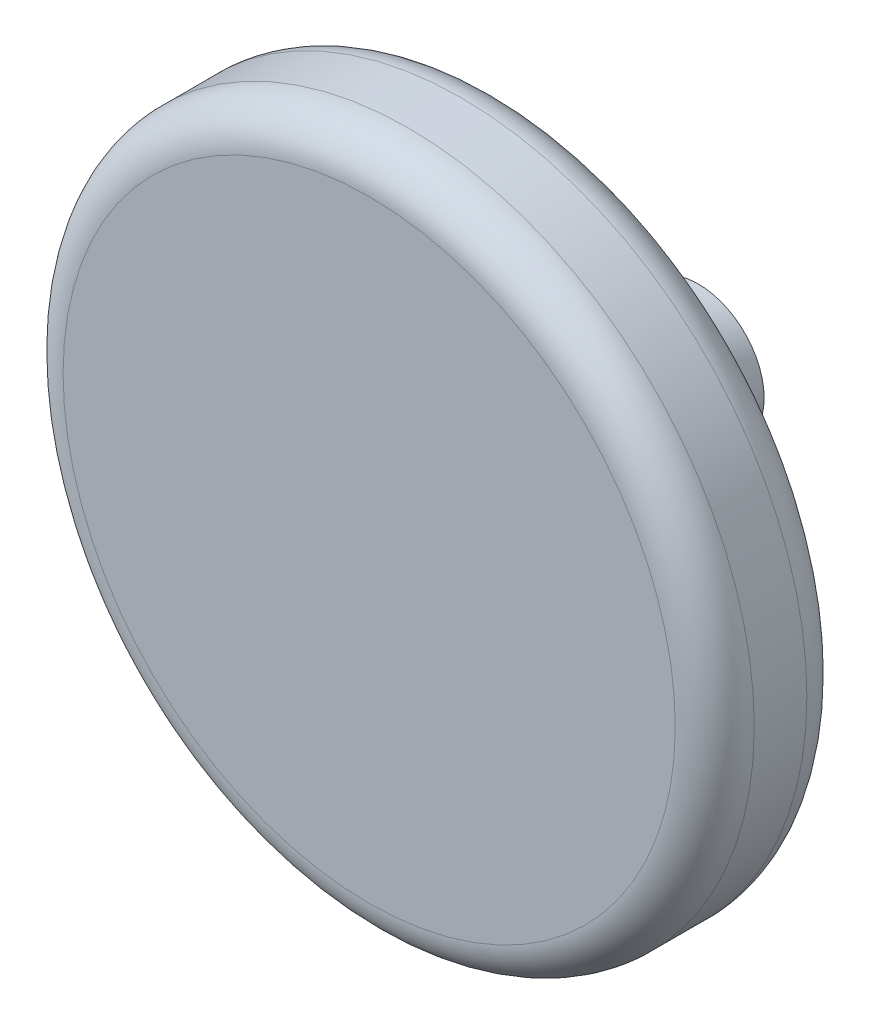
ISO-10303-21;
HEADER;
FILE_DESCRIPTION(('STEP AP214'),'2;1');
FILE_NAME('part.step','',(''),(''),'','','');
FILE_SCHEMA(('AUTOMOTIVE_DESIGN { 1 0 10303 214 1 1 1 1 }'));
ENDSEC;
DATA;
#1=APPLICATION_CONTEXT('core data for automotive mechanical design processes');
#2=APPLICATION_PROTOCOL_DEFINITION('international standard','automotive_design',2000,#1);
#3=PRODUCT_CONTEXT('',#1,'mechanical');
#4=PRODUCT('Part','Part','',(#3));
#5=PRODUCT_RELATED_PRODUCT_CATEGORY('part','',(#4));
#6=PRODUCT_DEFINITION_FORMATION('','',#4);
#7=PRODUCT_DEFINITION_CONTEXT('part definition',#1,'design');
#8=PRODUCT_DEFINITION('design','',#6,#7);
#9=PRODUCT_DEFINITION_SHAPE('','',#8);
#10=(LENGTH_UNIT() NAMED_UNIT(*) SI_UNIT(.MILLI.,.METRE.));
#11=(NAMED_UNIT(*) PLANE_ANGLE_UNIT() SI_UNIT($,.RADIAN.));
#12=(NAMED_UNIT(*) SI_UNIT($,.STERADIAN.) SOLID_ANGLE_UNIT());
#13=UNCERTAINTY_MEASURE_WITH_UNIT(LENGTH_MEASURE(1.E-05),#10,'distance_accuracy_value','');
#14=(GEOMETRIC_REPRESENTATION_CONTEXT(3) GLOBAL_UNCERTAINTY_ASSIGNED_CONTEXT((#13)) GLOBAL_UNIT_ASSIGNED_CONTEXT((#10,
#11,#12)) REPRESENTATION_CONTEXT('',''));
#15=CARTESIAN_POINT('',(0.,0.,0.));
#16=DIRECTION('',(0.,0.,1.));
#17=DIRECTION('',(1.,0.,0.));
#18=AXIS2_PLACEMENT_3D('',#15,#16,#17);
#19=CARTESIAN_POINT('',(0.,0.,0.));
#20=DIRECTION('',(0.,0.,1.));
#21=DIRECTION('',(1.,0.,0.));
#22=AXIS2_PLACEMENT_3D('',#19,#20,#21);
#23=PLANE('',#22);
#24=CARTESIAN_POINT('',(0.,0.,0.));
#25=DIRECTION('',(0.,0.,-1.));
#26=DIRECTION('',(-1.,0.,0.));
#27=AXIS2_PLACEMENT_3D('',#24,#25,#26);
#28=CIRCLE('',#27,1.6256);
#29=CARTESIAN_POINT('',(-1.6256,0.,0.));
#30=VERTEX_POINT('',#29);
#31=EDGE_CURVE('E59',#30,#30,#28,.T.);
#32=ORIENTED_EDGE('',*,*,#31,.F.);
#33=EDGE_LOOP('',(#32));
#34=FACE_BOUND('',#33,.T.);
#35=CARTESIAN_POINT('',(0.,0.,0.));
#36=DIRECTION('',(0.,0.,1.));
#37=DIRECTION('',(1.,0.,0.));
#38=AXIS2_PLACEMENT_3D('',#35,#36,#37);
#39=CIRCLE('',#38,4.23333333333333);
#40=CARTESIAN_POINT('',(4.23333333333333,0.,0.));
#41=VERTEX_POINT('',#40);
#42=EDGE_CURVE('E55',#41,#41,#39,.T.);
#43=ORIENTED_EDGE('',*,*,#42,.F.);
#44=EDGE_LOOP('',(#43));
#45=FACE_BOUND('',#44,.T.);
#46=ADVANCED_FACE('F32',(#34,#45),#23,.F.);
#47=CARTESIAN_POINT('',(0.,0.,21.1666666666667));
#48=DIRECTION('',(0.,0.,-1.));
#49=DIRECTION('',(-1.,0.,0.));
#50=AXIS2_PLACEMENT_3D('',#47,#48,#49);
#51=CYLINDRICAL_SURFACE('',#50,22.225);
#52=CARTESIAN_POINT('',(0.,0.,18.6266666666667));
#53=DIRECTION('',(0.,0.,1.));
#54=DIRECTION('',(1.,0.,0.));
#55=AXIS2_PLACEMENT_3D('',#52,#53,#54);
#56=CIRCLE('',#55,22.225);
#57=CARTESIAN_POINT('',(22.225,0.,18.6266666666667));
#58=VERTEX_POINT('',#57);
#59=EDGE_CURVE('E39',#58,#58,#56,.F.);
#60=ORIENTED_EDGE('',*,*,#59,.T.);
#61=EDGE_LOOP('',(#60));
#62=FACE_BOUND('',#61,.T.);
#63=CARTESIAN_POINT('',(0.,0.,15.24));
#64=DIRECTION('',(0.,0.,1.));
#65=DIRECTION('',(1.,0.,0.));
#66=AXIS2_PLACEMENT_3D('',#63,#64,#65);
#67=CIRCLE('',#66,22.225);
#68=CARTESIAN_POINT('',(22.225,0.,15.24));
#69=VERTEX_POINT('',#68);
#70=EDGE_CURVE('E43',#69,#69,#67,.T.);
#71=ORIENTED_EDGE('',*,*,#70,.T.);
#72=EDGE_LOOP('',(#71));
#73=FACE_BOUND('',#72,.T.);
#74=ADVANCED_FACE('F75',(#62,#73),#51,.T.);
#75=CARTESIAN_POINT('',(0.,0.,21.1666666666667));
#76=DIRECTION('',(0.,0.,1.));
#77=DIRECTION('',(1.,0.,0.));
#78=AXIS2_PLACEMENT_3D('',#75,#76,#77);
#79=PLANE('',#78);
#80=CARTESIAN_POINT('',(0.,0.,21.1666666666667));
#81=DIRECTION('',(0.,0.,1.));
#82=DIRECTION('',(1.,0.,0.));
#83=AXIS2_PLACEMENT_3D('',#80,#81,#82);
#84=CIRCLE('',#83,19.685);
#85=CARTESIAN_POINT('',(19.685,0.,21.1666666666667));
#86=VERTEX_POINT('',#85);
#87=EDGE_CURVE('E47',#86,#86,#84,.T.);
#88=ORIENTED_EDGE('',*,*,#87,.T.);
#89=EDGE_LOOP('',(#88));
#90=FACE_BOUND('',#89,.T.);
#91=ADVANCED_FACE('F88',(#90),#79,.T.);
#92=CARTESIAN_POINT('',(0.,0.,12.7));
#93=DIRECTION('',(0.,0.,1.));
#94=DIRECTION('',(1.,0.,0.));
#95=AXIS2_PLACEMENT_3D('',#92,#93,#94);
#96=PLANE('',#95);
#97=CARTESIAN_POINT('',(0.,0.,12.7));
#98=DIRECTION('',(0.,0.,1.));
#99=DIRECTION('',(1.,0.,0.));
#100=AXIS2_PLACEMENT_3D('',#97,#98,#99);
#101=CIRCLE('',#100,19.685);
#102=CARTESIAN_POINT('',(19.685,0.,12.7));
#103=VERTEX_POINT('',#102);
#104=EDGE_CURVE('E10',#103,#103,#101,.F.);
#105=ORIENTED_EDGE('',*,*,#104,.T.);
#106=EDGE_LOOP('',(#105));
#107=FACE_BOUND('',#106,.T.);
#108=CARTESIAN_POINT('',(0.,0.,12.7));
#109=DIRECTION('',(0.,0.,1.));
#110=DIRECTION('',(1.,0.,0.));
#111=AXIS2_PLACEMENT_3D('',#108,#109,#110);
#112=CIRCLE('',#111,16.9333333333333);
#113=CARTESIAN_POINT('',(16.9333333333333,0.,12.7));
#114=VERTEX_POINT('',#113);
#115=EDGE_CURVE('E52',#114,#114,#112,.T.);
#116=ORIENTED_EDGE('',*,*,#115,.T.);
#117=EDGE_LOOP('',(#116));
#118=FACE_BOUND('',#117,.T.);
#119=ADVANCED_FACE('F83',(#107,#118),#96,.F.);
#120=CARTESIAN_POINT('',(0.,0.,0.));
#121=DIRECTION('',(0.,0.,1.));
#122=DIRECTION('',(1.,0.,0.));
#123=AXIS2_PLACEMENT_3D('',#120,#121,#122);
#124=TOROIDAL_SURFACE('',#123,16.9333333333333,12.7);
#125=ORIENTED_EDGE('',*,*,#42,.T.);
#126=EDGE_LOOP('',(#125));
#127=FACE_BOUND('',#126,.T.);
#128=ORIENTED_EDGE('',*,*,#115,.F.);
#129=EDGE_LOOP('',(#128));
#130=FACE_BOUND('',#129,.T.);
#131=ADVANCED_FACE('F79',(#127,#130),#124,.F.);
#132=CARTESIAN_POINT('',(0.,0.,18.6266666666667));
#133=DIRECTION('',(0.,0.,1.));
#134=DIRECTION('',(1.,0.,0.));
#135=AXIS2_PLACEMENT_3D('',#132,#133,#134);
#136=TOROIDAL_SURFACE('',#135,19.685,2.54);
#137=ORIENTED_EDGE('',*,*,#59,.F.);
#138=EDGE_LOOP('',(#137));
#139=FACE_BOUND('',#138,.T.);
#140=ORIENTED_EDGE('',*,*,#87,.F.);
#141=EDGE_LOOP('',(#140));
#142=FACE_BOUND('',#141,.T.);
#143=ADVANCED_FACE('F82',(#139,#142),#136,.T.);
#144=CARTESIAN_POINT('',(0.,0.,15.24));
#145=DIRECTION('',(0.,0.,1.));
#146=DIRECTION('',(1.,0.,0.));
#147=AXIS2_PLACEMENT_3D('',#144,#145,#146);
#148=TOROIDAL_SURFACE('',#147,19.685,2.54);
#149=ORIENTED_EDGE('',*,*,#104,.F.);
#150=EDGE_LOOP('',(#149));
#151=FACE_BOUND('',#150,.T.);
#152=ORIENTED_EDGE('',*,*,#70,.F.);
#153=EDGE_LOOP('',(#152));
#154=FACE_BOUND('',#153,.T.);
#155=ADVANCED_FACE('F34',(#151,#154),#148,.T.);
#156=CARTESIAN_POINT('',(0.,0.,15.621));
#157=DIRECTION('',(0.,0.,-1.));
#158=DIRECTION('',(-1.,0.,0.));
#159=AXIS2_PLACEMENT_3D('',#156,#157,#158);
#160=CYLINDRICAL_SURFACE('',#159,1.6256);
#161=CARTESIAN_POINT('',(0.,0.,15.621));
#162=DIRECTION('',(0.,0.,-1.));
#163=DIRECTION('',(-1.,0.,0.));
#164=AXIS2_PLACEMENT_3D('',#161,#162,#163);
#165=CIRCLE('',#164,1.6256);
#166=CARTESIAN_POINT('',(-1.6256,0.,15.621));
#167=VERTEX_POINT('',#166);
#168=EDGE_CURVE('E58',#167,#167,#165,.T.);
#169=CARTESIAN_POINT('',(-1.6256,0.,15.621));
#170=CARTESIAN_POINT('',(-1.6256,0.,15.45828125));
#171=CARTESIAN_POINT('',(-1.6256,0.,15.2955625));
#172=CARTESIAN_POINT('',(-1.6256,0.,14.970125));
#173=CARTESIAN_POINT('',(-1.6256,0.,14.80740625));
#174=CARTESIAN_POINT('',(-1.6256,0.,14.48196875));
#175=CARTESIAN_POINT('',(-1.6256,0.,14.31925));
#176=CARTESIAN_POINT('',(-1.6256,0.,13.9938125));
#177=CARTESIAN_POINT('',(-1.6256,0.,13.83109375));
#178=CARTESIAN_POINT('',(-1.6256,0.,13.50565625));
#179=CARTESIAN_POINT('',(-1.6256,0.,13.3429375));
#180=CARTESIAN_POINT('',(-1.6256,0.,13.0175));
#181=CARTESIAN_POINT('',(-1.6256,0.,12.85478125));
#182=CARTESIAN_POINT('',(-1.6256,0.,12.52934375));
#183=CARTESIAN_POINT('',(-1.6256,0.,12.366625));
#184=CARTESIAN_POINT('',(-1.6256,0.,12.0411875));
#185=CARTESIAN_POINT('',(-1.6256,0.,11.87846875));
#186=CARTESIAN_POINT('',(-1.6256,0.,11.55303125));
#187=CARTESIAN_POINT('',(-1.6256,0.,11.3903125));
#188=CARTESIAN_POINT('',(-1.6256,0.,11.064875));
#189=CARTESIAN_POINT('',(-1.6256,0.,10.90215625));
#190=CARTESIAN_POINT('',(-1.6256,0.,10.57671875));
#191=CARTESIAN_POINT('',(-1.6256,0.,10.414));
#192=CARTESIAN_POINT('',(-1.6256,0.,10.0885625));
#193=CARTESIAN_POINT('',(-1.6256,0.,9.92584375));
#194=CARTESIAN_POINT('',(-1.6256,0.,9.60040625));
#195=CARTESIAN_POINT('',(-1.6256,0.,9.4376875));
#196=CARTESIAN_POINT('',(-1.6256,0.,9.11225));
#197=CARTESIAN_POINT('',(-1.6256,0.,8.94953125));
#198=CARTESIAN_POINT('',(-1.6256,0.,8.62409375));
#199=CARTESIAN_POINT('',(-1.6256,0.,8.461375));
#200=CARTESIAN_POINT('',(-1.6256,0.,8.1359375));
#201=CARTESIAN_POINT('',(-1.6256,0.,7.97321875));
#202=CARTESIAN_POINT('',(-1.6256,0.,7.64778125));
#203=CARTESIAN_POINT('',(-1.6256,0.,7.4850625));
#204=CARTESIAN_POINT('',(-1.6256,0.,7.159625));
#205=CARTESIAN_POINT('',(-1.6256,0.,6.99690625));
#206=CARTESIAN_POINT('',(-1.6256,0.,6.67146875));
#207=CARTESIAN_POINT('',(-1.6256,0.,6.50875));
#208=CARTESIAN_POINT('',(-1.6256,0.,6.1833125));
#209=CARTESIAN_POINT('',(-1.6256,0.,6.02059375));
#210=CARTESIAN_POINT('',(-1.6256,0.,5.69515625));
#211=CARTESIAN_POINT('',(-1.6256,0.,5.5324375));
#212=CARTESIAN_POINT('',(-1.6256,0.,5.207));
#213=CARTESIAN_POINT('',(-1.6256,0.,5.04428125));
#214=CARTESIAN_POINT('',(-1.6256,0.,4.71884375));
#215=CARTESIAN_POINT('',(-1.6256,0.,4.556125));
#216=CARTESIAN_POINT('',(-1.6256,0.,4.2306875));
#217=CARTESIAN_POINT('',(-1.6256,0.,4.06796875));
#218=CARTESIAN_POINT('',(-1.6256,0.,3.74253125));
#219=CARTESIAN_POINT('',(-1.6256,0.,3.5798125));
#220=CARTESIAN_POINT('',(-1.6256,0.,3.254375));
#221=CARTESIAN_POINT('',(-1.6256,0.,3.09165625));
#222=CARTESIAN_POINT('',(-1.6256,0.,2.76621875));
#223=CARTESIAN_POINT('',(-1.6256,0.,2.6035));
#224=CARTESIAN_POINT('',(-1.6256,0.,2.2780625));
#225=CARTESIAN_POINT('',(-1.6256,0.,2.11534375));
#226=CARTESIAN_POINT('',(-1.6256,0.,1.78990625));
#227=CARTESIAN_POINT('',(-1.6256,0.,1.6271875));
#228=CARTESIAN_POINT('',(-1.6256,0.,1.30175));
#229=CARTESIAN_POINT('',(-1.6256,0.,1.13903125));
#230=CARTESIAN_POINT('',(-1.6256,0.,0.813593750000002));
#231=CARTESIAN_POINT('',(-1.6256,0.,0.650875000000002));
#232=CARTESIAN_POINT('',(-1.6256,0.,0.325437500000002));
#233=CARTESIAN_POINT('',(-1.6256,0.,0.162718750000001));
#234=CARTESIAN_POINT('',(-1.6256,0.,0.));
#235=B_SPLINE_CURVE_WITH_KNOTS('',3,(#169,#170,#171,#172,#173,#174,#175,#176,#177,#178,#179,
#180,#181,#182,#183,#184,#185,#186,#187,#188,#189,#190,#191,#192,#193,#194,#195,#196,#197,#198,
#199,#200,#201,#202,#203,#204,#205,#206,#207,#208,#209,#210,#211,#212,#213,#214,#215,#216,#217,
#218,#219,#220,#221,#222,#223,#224,#225,#226,#227,#228,#229,#230,#231,#232,#233,#234),
.UNSPECIFIED.,.F.,.F.,(4,2,2,2,2,2,2,2,2,2,2,2,2,2,2,2,2,2,2,2,2,2,2,2,2,2,2,2,2,2,2,2,4),(0.,
0.48815625,0.9763125,1.46446875,1.952625,2.44078125,2.9289375,3.41709375,3.90525,4.39340625,
4.8815625,5.36971875,5.857875,6.34603125,6.8341875,7.32234375,7.8105,8.29865625,8.7868125,
9.27496875,9.763125,10.25128125,10.7394375,11.22759375,11.71575,12.20390625,12.6920625,
13.18021875,13.668375,14.15653125,14.6446875,15.13284375,15.621),.UNSPECIFIED.);
#236=EDGE_CURVE('BSEAM67',#167,#30,#235,.T.);
#237=ORIENTED_EDGE('',*,*,#168,.F.);
#238=ORIENTED_EDGE('',*,*,#31,.T.);
#239=ORIENTED_EDGE('',*,*,#236,.T.);
#240=ORIENTED_EDGE('',*,*,#236,.F.);
#241=EDGE_LOOP('',(#237,#239,#238,#240));
#242=FACE_BOUND('',#241,.T.);
#243=ADVANCED_FACE('F67',(#242),#160,.F.);
#244=CARTESIAN_POINT('',(0.,0.,15.621));
#245=DIRECTION('',(0.,0.,-1.));
#246=DIRECTION('',(-1.,0.,0.));
#247=AXIS2_PLACEMENT_3D('',#244,#245,#246);
#248=PLANE('',#247);
#249=ORIENTED_EDGE('',*,*,#168,.T.);
#250=EDGE_LOOP('',(#249));
#251=FACE_BOUND('',#250,.T.);
#252=ADVANCED_FACE('F65',(#251),#248,.T.);
#253=CLOSED_SHELL('',(#46,#74,#91,#119,#131,#143,#155,#243,#252));
#254=MANIFOLD_SOLID_BREP('B2',#253);
#255=ADVANCED_BREP_SHAPE_REPRESENTATION('',(#18,#254),#14);
#256=SHAPE_DEFINITION_REPRESENTATION(#9,#255);
ENDSEC;
END-ISO-10303-21;
